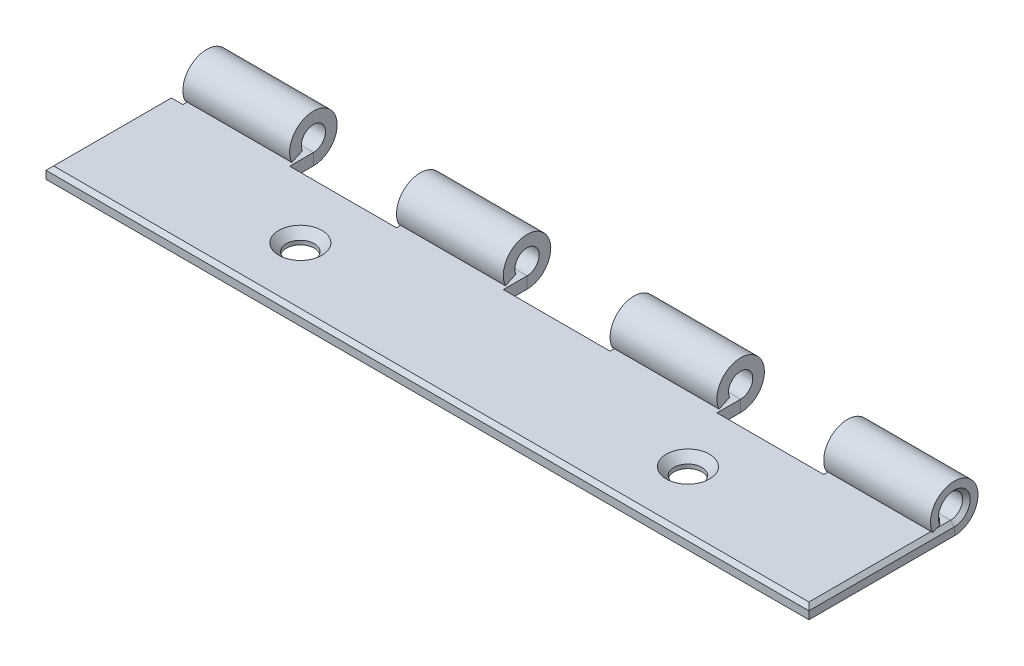
ISO-10303-21;
HEADER;
FILE_DESCRIPTION(('STEP AP214'),'2;1');
FILE_NAME('part.step','',(''),(''),'','','');
FILE_SCHEMA(('AUTOMOTIVE_DESIGN { 1 0 10303 214 1 1 1 1 }'));
ENDSEC;
DATA;
#1=APPLICATION_CONTEXT('core data for automotive mechanical design processes');
#2=APPLICATION_PROTOCOL_DEFINITION('international standard','automotive_design',2000,#1);
#3=PRODUCT_CONTEXT('',#1,'mechanical');
#4=PRODUCT('Part','Part','',(#3));
#5=PRODUCT_RELATED_PRODUCT_CATEGORY('part','',(#4));
#6=PRODUCT_DEFINITION_FORMATION('','',#4);
#7=PRODUCT_DEFINITION_CONTEXT('part definition',#1,'design');
#8=PRODUCT_DEFINITION('design','',#6,#7);
#9=PRODUCT_DEFINITION_SHAPE('','',#8);
#10=(LENGTH_UNIT() NAMED_UNIT(*) SI_UNIT(.MILLI.,.METRE.));
#11=(NAMED_UNIT(*) PLANE_ANGLE_UNIT() SI_UNIT($,.RADIAN.));
#12=(NAMED_UNIT(*) SI_UNIT($,.STERADIAN.) SOLID_ANGLE_UNIT());
#13=UNCERTAINTY_MEASURE_WITH_UNIT(LENGTH_MEASURE(1.E-05),#10,'distance_accuracy_value','');
#14=(GEOMETRIC_REPRESENTATION_CONTEXT(3) GLOBAL_UNCERTAINTY_ASSIGNED_CONTEXT((#13)) GLOBAL_UNIT_ASSIGNED_CONTEXT((#10,
#11,#12)) REPRESENTATION_CONTEXT('',''));
#15=CARTESIAN_POINT('',(0.,0.,0.));
#16=DIRECTION('',(0.,0.,1.));
#17=DIRECTION('',(1.,0.,0.));
#18=AXIS2_PLACEMENT_3D('',#15,#16,#17);
#19=CARTESIAN_POINT('',(-48.,-1.524,-4.85775));
#20=DIRECTION('',(1.,0.,0.));
#21=DIRECTION('',(0.,0.,-1.));
#22=AXIS2_PLACEMENT_3D('',#19,#20,#21);
#23=PLANE('',#22);
#24=DIRECTION('',(0.,0.,1.));
#25=VECTOR('',#24,1.);
#26=CARTESIAN_POINT('',(-48.,0.,0.));
#27=LINE('',#26,#25);
#28=CARTESIAN_POINT('',(-48.,0.,-7.96925));
#29=VERTEX_POINT('',#28);
#30=CARTESIAN_POINT('',(-48.,0.,-4.85775));
#31=VERTEX_POINT('',#30);
#32=EDGE_CURVE('E267',#29,#31,#27,.T.);
#33=ORIENTED_EDGE('',*,*,#32,.F.);
#34=DIRECTION('',(0.,-1.,0.));
#35=VECTOR('',#34,1.);
#36=CARTESIAN_POINT('',(-48.,0.,-7.96925));
#37=LINE('',#36,#35);
#38=CARTESIAN_POINT('',(-48.,-1.524,-7.96925));
#39=VERTEX_POINT('',#38);
#40=EDGE_CURVE('E252',#29,#39,#37,.T.);
#41=ORIENTED_EDGE('',*,*,#40,.T.);
#42=DIRECTION('',(0.,0.,-1.));
#43=VECTOR('',#42,1.);
#44=CARTESIAN_POINT('',(-48.,-1.524,-4.85775));
#45=LINE('',#44,#43);
#46=CARTESIAN_POINT('',(-48.,-1.524,-4.85775));
#47=VERTEX_POINT('',#46);
#48=EDGE_CURVE('E251',#47,#39,#45,.T.);
#49=ORIENTED_EDGE('',*,*,#48,.F.);
#50=DIRECTION('',(0.,1.,0.));
#51=VECTOR('',#50,1.);
#52=CARTESIAN_POINT('',(-48.,-1.524,-4.85775));
#53=LINE('',#52,#51);
#54=EDGE_CURVE('E236',#47,#31,#53,.T.);
#55=ORIENTED_EDGE('',*,*,#54,.T.);
#56=EDGE_LOOP('',(#33,#41,#49,#55));
#57=FACE_BOUND('',#56,.T.);
#58=ADVANCED_FACE('F47',(#57),#23,.F.);
#59=CARTESIAN_POINT('',(-34.,-1.524,-4.85775));
#60=DIRECTION('',(-1.,0.,0.));
#61=DIRECTION('',(0.,0.,1.));
#62=AXIS2_PLACEMENT_3D('',#59,#60,#61);
#63=PLANE('',#62);
#64=DIRECTION('',(0.,0.,1.));
#65=VECTOR('',#64,1.);
#66=CARTESIAN_POINT('',(-34.,-1.524,-4.85775));
#67=LINE('',#66,#65);
#68=CARTESIAN_POINT('',(-34.,-1.524,-7.96925));
#69=VERTEX_POINT('',#68);
#70=CARTESIAN_POINT('',(-34.,-1.524,-4.85775));
#71=VERTEX_POINT('',#70);
#72=EDGE_CURVE('E277',#69,#71,#67,.T.);
#73=ORIENTED_EDGE('',*,*,#72,.F.);
#74=DIRECTION('',(0.,1.,0.));
#75=VECTOR('',#74,1.);
#76=CARTESIAN_POINT('',(-34.,-1.524,-7.96925));
#77=LINE('',#76,#75);
#78=CARTESIAN_POINT('',(-34.,0.,-7.96925));
#79=VERTEX_POINT('',#78);
#80=EDGE_CURVE('E441',#69,#79,#77,.T.);
#81=ORIENTED_EDGE('',*,*,#80,.T.);
#82=DIRECTION('',(0.,0.,-1.));
#83=VECTOR('',#82,1.);
#84=CARTESIAN_POINT('',(-34.,0.,0.));
#85=LINE('',#84,#83);
#86=CARTESIAN_POINT('',(-34.,0.,-4.85775));
#87=VERTEX_POINT('',#86);
#88=EDGE_CURVE('E291',#87,#79,#85,.T.);
#89=ORIENTED_EDGE('',*,*,#88,.F.);
#90=DIRECTION('',(0.,1.,0.));
#91=VECTOR('',#90,1.);
#92=CARTESIAN_POINT('',(-34.,-1.524,-4.85775));
#93=LINE('',#92,#91);
#94=EDGE_CURVE('E283',#71,#87,#93,.T.);
#95=ORIENTED_EDGE('',*,*,#94,.F.);
#96=EDGE_LOOP('',(#73,#81,#89,#95));
#97=FACE_BOUND('',#96,.T.);
#98=ADVANCED_FACE('F515',(#97),#63,.F.);
#99=CARTESIAN_POINT('',(-20.,-1.524,-4.85775));
#100=DIRECTION('',(1.,0.,0.));
#101=DIRECTION('',(0.,0.,-1.));
#102=AXIS2_PLACEMENT_3D('',#99,#100,#101);
#103=PLANE('',#102);
#104=DIRECTION('',(0.,0.,1.));
#105=VECTOR('',#104,1.);
#106=CARTESIAN_POINT('',(-20.,0.,0.));
#107=LINE('',#106,#105);
#108=CARTESIAN_POINT('',(-20.,0.,-7.96925));
#109=VERTEX_POINT('',#108);
#110=CARTESIAN_POINT('',(-20.,0.,-4.85775));
#111=VERTEX_POINT('',#110);
#112=EDGE_CURVE('E298',#109,#111,#107,.T.);
#113=ORIENTED_EDGE('',*,*,#112,.F.);
#114=DIRECTION('',(0.,-1.,0.));
#115=VECTOR('',#114,1.);
#116=CARTESIAN_POINT('',(-20.,0.,-7.96925));
#117=LINE('',#116,#115);
#118=CARTESIAN_POINT('',(-20.,-1.524,-7.96925));
#119=VERTEX_POINT('',#118);
#120=EDGE_CURVE('E439',#109,#119,#117,.T.);
#121=ORIENTED_EDGE('',*,*,#120,.T.);
#122=DIRECTION('',(0.,0.,-1.));
#123=VECTOR('',#122,1.);
#124=CARTESIAN_POINT('',(-20.,-1.524,-4.85775));
#125=LINE('',#124,#123);
#126=CARTESIAN_POINT('',(-20.,-1.524,-4.85775));
#127=VERTEX_POINT('',#126);
#128=EDGE_CURVE('E274',#127,#119,#125,.T.);
#129=ORIENTED_EDGE('',*,*,#128,.F.);
#130=DIRECTION('',(0.,1.,0.));
#131=VECTOR('',#130,1.);
#132=CARTESIAN_POINT('',(-20.,-1.524,-4.85775));
#133=LINE('',#132,#131);
#134=EDGE_CURVE('E284',#127,#111,#133,.T.);
#135=ORIENTED_EDGE('',*,*,#134,.T.);
#136=EDGE_LOOP('',(#113,#121,#129,#135));
#137=FACE_BOUND('',#136,.T.);
#138=ADVANCED_FACE('F521',(#137),#103,.F.);
#139=CARTESIAN_POINT('',(-5.99999999999999,-1.524,-4.85775));
#140=DIRECTION('',(-1.,0.,0.));
#141=DIRECTION('',(0.,0.,1.));
#142=AXIS2_PLACEMENT_3D('',#139,#140,#141);
#143=PLANE('',#142);
#144=DIRECTION('',(0.,0.,1.));
#145=VECTOR('',#144,1.);
#146=CARTESIAN_POINT('',(-5.99999999999999,-1.524,-4.85775));
#147=LINE('',#146,#145);
#148=CARTESIAN_POINT('',(-5.99999999999999,-1.524,-7.96925));
#149=VERTEX_POINT('',#148);
#150=CARTESIAN_POINT('',(-5.99999999999999,-1.524,-4.85775));
#151=VERTEX_POINT('',#150);
#152=EDGE_CURVE('E310',#149,#151,#147,.T.);
#153=ORIENTED_EDGE('',*,*,#152,.F.);
#154=DIRECTION('',(0.,1.,0.));
#155=VECTOR('',#154,1.);
#156=CARTESIAN_POINT('',(-5.99999999999999,-1.524,-7.96925));
#157=LINE('',#156,#155);
#158=CARTESIAN_POINT('',(-5.99999999999999,0.,-7.96925));
#159=VERTEX_POINT('',#158);
#160=EDGE_CURVE('E437',#149,#159,#157,.T.);
#161=ORIENTED_EDGE('',*,*,#160,.T.);
#162=DIRECTION('',(0.,0.,-1.));
#163=VECTOR('',#162,1.);
#164=CARTESIAN_POINT('',(-5.99999999999999,0.,0.));
#165=LINE('',#164,#163);
#166=CARTESIAN_POINT('',(-5.99999999999999,0.,-4.85775));
#167=VERTEX_POINT('',#166);
#168=EDGE_CURVE('E324',#167,#159,#165,.T.);
#169=ORIENTED_EDGE('',*,*,#168,.F.);
#170=DIRECTION('',(0.,1.,0.));
#171=VECTOR('',#170,1.);
#172=CARTESIAN_POINT('',(-5.99999999999999,-1.524,-4.85775));
#173=LINE('',#172,#171);
#174=EDGE_CURVE('E316',#151,#167,#173,.T.);
#175=ORIENTED_EDGE('',*,*,#174,.F.);
#176=EDGE_LOOP('',(#153,#161,#169,#175));
#177=FACE_BOUND('',#176,.T.);
#178=ADVANCED_FACE('F620',(#177),#143,.F.);
#179=CARTESIAN_POINT('',(8.,-1.524,-4.85775));
#180=DIRECTION('',(1.,0.,0.));
#181=DIRECTION('',(0.,0.,-1.));
#182=AXIS2_PLACEMENT_3D('',#179,#180,#181);
#183=PLANE('',#182);
#184=DIRECTION('',(0.,0.,1.));
#185=VECTOR('',#184,1.);
#186=CARTESIAN_POINT('',(8.,0.,0.));
#187=LINE('',#186,#185);
#188=CARTESIAN_POINT('',(8.00000000000001,0.,-7.96925));
#189=VERTEX_POINT('',#188);
#190=CARTESIAN_POINT('',(8.,0.,-4.85775));
#191=VERTEX_POINT('',#190);
#192=EDGE_CURVE('E331',#189,#191,#187,.T.);
#193=ORIENTED_EDGE('',*,*,#192,.F.);
#194=DIRECTION('',(0.,-1.,0.));
#195=VECTOR('',#194,1.);
#196=CARTESIAN_POINT('',(8.00000000000001,0.,-7.96925));
#197=LINE('',#196,#195);
#198=CARTESIAN_POINT('',(8.,-1.524,-7.96925));
#199=VERTEX_POINT('',#198);
#200=EDGE_CURVE('E435',#189,#199,#197,.T.);
#201=ORIENTED_EDGE('',*,*,#200,.T.);
#202=DIRECTION('',(0.,0.,-1.));
#203=VECTOR('',#202,1.);
#204=CARTESIAN_POINT('',(8.,-1.524,-4.85775));
#205=LINE('',#204,#203);
#206=CARTESIAN_POINT('',(8.,-1.524,-4.85775));
#207=VERTEX_POINT('',#206);
#208=EDGE_CURVE('E307',#207,#199,#205,.T.);
#209=ORIENTED_EDGE('',*,*,#208,.F.);
#210=DIRECTION('',(0.,1.,0.));
#211=VECTOR('',#210,1.);
#212=CARTESIAN_POINT('',(8.,-1.524,-4.85775));
#213=LINE('',#212,#211);
#214=EDGE_CURVE('E317',#207,#191,#213,.T.);
#215=ORIENTED_EDGE('',*,*,#214,.T.);
#216=EDGE_LOOP('',(#193,#201,#209,#215));
#217=FACE_BOUND('',#216,.T.);
#218=ADVANCED_FACE('F644',(#217),#183,.F.);
#219=CARTESIAN_POINT('',(0.,0.916593509486624,-6.53048638807933));
#220=DIRECTION('',(0.,0.906307787036645,0.42261826174071));
#221=DIRECTION('',(-1.,0.,0.));
#222=AXIS2_PLACEMENT_3D('',#219,#220,#221);
#223=PLANE('',#222);
#224=DIRECTION('',(0.,0.42261826174071,-0.906307787036645));
#225=VECTOR('',#224,1.);
#226=CARTESIAN_POINT('',(-20.,0.916593509486624,-6.53048638807933));
#227=LINE('',#226,#225);
#228=CARTESIAN_POINT('',(-20.,0.916593509486624,-6.53048638807933));
#229=VERTEX_POINT('',#228);
#230=CARTESIAN_POINT('',(-20.,0.272523278593782,-5.14927332063548));
#231=VERTEX_POINT('',#230);
#232=EDGE_CURVE('E296',#229,#231,#227,.F.);
#233=ORIENTED_EDGE('',*,*,#232,.F.);
#234=DIRECTION('',(-1.,0.,0.));
#235=VECTOR('',#234,1.);
#236=CARTESIAN_POINT('',(-50.,0.916593509486624,-6.53048638807933));
#237=LINE('',#236,#235);
#238=CARTESIAN_POINT('',(-5.99999999999999,0.916593509486624,-6.53048638807933));
#239=VERTEX_POINT('',#238);
#240=EDGE_CURVE('E557',#239,#229,#237,.T.);
#241=ORIENTED_EDGE('',*,*,#240,.F.);
#242=DIRECTION('',(0.,-0.42261826174071,0.906307787036645));
#243=VECTOR('',#242,1.);
#244=CARTESIAN_POINT('',(-5.99999999999999,0.916593509486624,-6.53048638807933));
#245=LINE('',#244,#243);
#246=CARTESIAN_POINT('',(-5.99999999999999,0.272523278593782,-5.14927332063548));
#247=VERTEX_POINT('',#246);
#248=EDGE_CURVE('E320',#247,#239,#245,.F.);
#249=ORIENTED_EDGE('',*,*,#248,.F.);
#250=DIRECTION('',(-1.,0.,0.));
#251=VECTOR('',#250,1.);
#252=CARTESIAN_POINT('',(-50.,0.272523278593782,-5.14927332063548));
#253=LINE('',#252,#251);
#254=EDGE_CURVE('E632',#247,#231,#253,.T.);
#255=ORIENTED_EDGE('',*,*,#254,.T.);
#256=EDGE_LOOP('',(#233,#241,#249,#255));
#257=FACE_BOUND('',#256,.T.);
#258=ADVANCED_FACE('F635',(#257),#223,.F.);
#259=CARTESIAN_POINT('',(-50.,1.5875,-7.96925));
#260=DIRECTION('',(-1.,0.,0.));
#261=DIRECTION('',(0.,-0.42261826174071,0.906307787036645));
#262=AXIS2_PLACEMENT_3D('',#259,#260,#261);
#263=CYLINDRICAL_SURFACE('',#262,3.1115);
#264=DIRECTION('',(-1.,0.,0.));
#265=VECTOR('',#264,1.);
#266=CARTESIAN_POINT('',(-50.,-1.524,-7.96925000000001));
#267=LINE('',#266,#265);
#268=EDGE_CURVE('E377',#119,#149,#267,.F.);
#269=ORIENTED_EDGE('',*,*,#268,.F.);
#270=CARTESIAN_POINT('',(-20.,1.5875,-7.96925));
#271=DIRECTION('',(1.,0.,0.));
#272=DIRECTION('',(0.,0.,-1.));
#273=AXIS2_PLACEMENT_3D('',#270,#271,#272);
#274=CIRCLE('',#273,3.1115);
#275=EDGE_CURVE('E301',#231,#119,#274,.F.);
#276=ORIENTED_EDGE('',*,*,#275,.F.);
#277=ORIENTED_EDGE('',*,*,#254,.F.);
#278=CARTESIAN_POINT('',(-5.99999999999999,1.5875,-7.96925));
#279=DIRECTION('',(-1.,0.,0.));
#280=DIRECTION('',(0.,0.,1.));
#281=AXIS2_PLACEMENT_3D('',#278,#279,#280);
#282=CIRCLE('',#281,3.1115);
#283=EDGE_CURVE('E327',#149,#247,#282,.F.);
#284=ORIENTED_EDGE('',*,*,#283,.F.);
#285=EDGE_LOOP('',(#269,#276,#277,#284));
#286=FACE_BOUND('',#285,.T.);
#287=ADVANCED_FACE('F629',(#286),#263,.T.);
#288=CARTESIAN_POINT('',(-50.,1.5875,-7.96925));
#289=DIRECTION('',(-1.,0.,0.));
#290=DIRECTION('',(0.,-0.42261826174071,0.906307787036645));
#291=AXIS2_PLACEMENT_3D('',#288,#289,#290);
#292=CYLINDRICAL_SURFACE('',#291,1.5875);
#293=ORIENTED_EDGE('',*,*,#240,.T.);
#294=CARTESIAN_POINT('',(-20.,1.5875,-7.96925));
#295=DIRECTION('',(1.,0.,0.));
#296=DIRECTION('',(0.,0.,-1.));
#297=AXIS2_PLACEMENT_3D('',#294,#295,#296);
#298=CIRCLE('',#297,1.5875);
#299=EDGE_CURVE('E429',#229,#109,#298,.F.);
#300=ORIENTED_EDGE('',*,*,#299,.T.);
#301=DIRECTION('',(-1.,0.,0.));
#302=VECTOR('',#301,1.);
#303=CARTESIAN_POINT('',(-50.,0.,-7.96925));
#304=LINE('',#303,#302);
#305=EDGE_CURVE('E390',#109,#159,#304,.F.);
#306=ORIENTED_EDGE('',*,*,#305,.T.);
#307=CARTESIAN_POINT('',(-5.99999999999999,1.5875,-7.96925));
#308=DIRECTION('',(-1.,0.,0.));
#309=DIRECTION('',(0.,0.,1.));
#310=AXIS2_PLACEMENT_3D('',#307,#308,#309);
#311=CIRCLE('',#310,1.5875);
#312=EDGE_CURVE('E420',#159,#239,#311,.F.);
#313=ORIENTED_EDGE('',*,*,#312,.T.);
#314=EDGE_LOOP('',(#293,#300,#306,#313));
#315=FACE_BOUND('',#314,.T.);
#316=ADVANCED_FACE('F614',(#315),#292,.F.);
#317=DIRECTION('',(0.,0.42261826174071,-0.906307787036645));
#318=VECTOR('',#317,1.);
#319=CARTESIAN_POINT('',(8.,0.916593509486624,-6.53048638807933));
#320=LINE('',#319,#318);
#321=CARTESIAN_POINT('',(8.00000000000001,0.916593509486624,-6.53048638807933));
#322=VERTEX_POINT('',#321);
#323=CARTESIAN_POINT('',(8.,0.272523278593782,-5.14927332063548));
#324=VERTEX_POINT('',#323);
#325=EDGE_CURVE('E329',#322,#324,#320,.F.);
#326=ORIENTED_EDGE('',*,*,#325,.F.);
#327=CARTESIAN_POINT('',(22.,0.916593509486624,-6.53048638807933));
#328=VERTEX_POINT('',#327);
#329=EDGE_CURVE('E394',#328,#322,#237,.T.);
#330=ORIENTED_EDGE('',*,*,#329,.F.);
#331=DIRECTION('',(0.,-0.42261826174071,0.906307787036645));
#332=VECTOR('',#331,1.);
#333=CARTESIAN_POINT('',(22.,0.916593509486624,-6.53048638807933));
#334=LINE('',#333,#332);
#335=CARTESIAN_POINT('',(22.,0.272523278593782,-5.14927332063548));
#336=VERTEX_POINT('',#335);
#337=EDGE_CURVE('E353',#336,#328,#334,.F.);
#338=ORIENTED_EDGE('',*,*,#337,.F.);
#339=EDGE_CURVE('E385',#336,#324,#253,.T.);
#340=ORIENTED_EDGE('',*,*,#339,.T.);
#341=EDGE_LOOP('',(#326,#330,#338,#340));
#342=FACE_BOUND('',#341,.T.);
#343=ADVANCED_FACE('F570',(#342),#223,.F.);
#344=CARTESIAN_POINT('',(22.,-1.524,-7.96925));
#345=VERTEX_POINT('',#344);
#346=EDGE_CURVE('E580',#199,#345,#267,.F.);
#347=ORIENTED_EDGE('',*,*,#346,.F.);
#348=CARTESIAN_POINT('',(8.00000000000001,1.5875,-7.96925));
#349=DIRECTION('',(1.,0.,0.));
#350=DIRECTION('',(0.,0.,-1.));
#351=AXIS2_PLACEMENT_3D('',#348,#349,#350);
#352=CIRCLE('',#351,3.1115);
#353=EDGE_CURVE('E334',#324,#199,#352,.F.);
#354=ORIENTED_EDGE('',*,*,#353,.F.);
#355=ORIENTED_EDGE('',*,*,#339,.F.);
#356=CARTESIAN_POINT('',(22.,1.5875,-7.96925));
#357=DIRECTION('',(-1.,0.,0.));
#358=DIRECTION('',(0.,0.,1.));
#359=AXIS2_PLACEMENT_3D('',#356,#357,#358);
#360=CIRCLE('',#359,3.1115);
#361=EDGE_CURVE('E360',#345,#336,#360,.F.);
#362=ORIENTED_EDGE('',*,*,#361,.F.);
#363=EDGE_LOOP('',(#347,#354,#355,#362));
#364=FACE_BOUND('',#363,.T.);
#365=ADVANCED_FACE('F578',(#364),#263,.T.);
#366=ORIENTED_EDGE('',*,*,#329,.T.);
#367=CARTESIAN_POINT('',(8.00000000000001,1.5875,-7.96925));
#368=DIRECTION('',(1.,0.,0.));
#369=DIRECTION('',(0.,0.,-1.));
#370=AXIS2_PLACEMENT_3D('',#367,#368,#369);
#371=CIRCLE('',#370,1.5875);
#372=EDGE_CURVE('E423',#322,#189,#371,.F.);
#373=ORIENTED_EDGE('',*,*,#372,.T.);
#374=CARTESIAN_POINT('',(22.,0.,-7.96925));
#375=VERTEX_POINT('',#374);
#376=EDGE_CURVE('E610',#189,#375,#304,.F.);
#377=ORIENTED_EDGE('',*,*,#376,.T.);
#378=CARTESIAN_POINT('',(22.,1.5875,-7.96925));
#379=DIRECTION('',(-1.,0.,0.));
#380=DIRECTION('',(0.,0.,1.));
#381=AXIS2_PLACEMENT_3D('',#378,#379,#380);
#382=CIRCLE('',#381,1.5875);
#383=EDGE_CURVE('E408',#375,#328,#382,.F.);
#384=ORIENTED_EDGE('',*,*,#383,.T.);
#385=EDGE_LOOP('',(#366,#373,#377,#384));
#386=FACE_BOUND('',#385,.T.);
#387=ADVANCED_FACE('F564',(#386),#292,.F.);
#388=CARTESIAN_POINT('',(22.,-1.524,-4.85775));
#389=DIRECTION('',(-1.,0.,0.));
#390=DIRECTION('',(0.,0.,1.));
#391=AXIS2_PLACEMENT_3D('',#388,#389,#390);
#392=PLANE('',#391);
#393=DIRECTION('',(0.,0.,1.));
#394=VECTOR('',#393,1.);
#395=CARTESIAN_POINT('',(22.,-1.524,-4.85775));
#396=LINE('',#395,#394);
#397=CARTESIAN_POINT('',(22.,-1.524,-4.85775));
#398=VERTEX_POINT('',#397);
#399=EDGE_CURVE('E343',#345,#398,#396,.T.);
#400=ORIENTED_EDGE('',*,*,#399,.F.);
#401=DIRECTION('',(0.,1.,0.));
#402=VECTOR('',#401,1.);
#403=CARTESIAN_POINT('',(22.,-1.524,-7.96925));
#404=LINE('',#403,#402);
#405=EDGE_CURVE('E417',#345,#375,#404,.T.);
#406=ORIENTED_EDGE('',*,*,#405,.T.);
#407=DIRECTION('',(0.,0.,-1.));
#408=VECTOR('',#407,1.);
#409=CARTESIAN_POINT('',(22.,0.,0.));
#410=LINE('',#409,#408);
#411=CARTESIAN_POINT('',(22.,0.,-4.85775));
#412=VERTEX_POINT('',#411);
#413=EDGE_CURVE('E357',#412,#375,#410,.T.);
#414=ORIENTED_EDGE('',*,*,#413,.F.);
#415=DIRECTION('',(0.,1.,0.));
#416=VECTOR('',#415,1.);
#417=CARTESIAN_POINT('',(22.,-1.524,-4.85775));
#418=LINE('',#417,#416);
#419=EDGE_CURVE('E349',#398,#412,#418,.T.);
#420=ORIENTED_EDGE('',*,*,#419,.F.);
#421=EDGE_LOOP('',(#400,#406,#414,#420));
#422=FACE_BOUND('',#421,.T.);
#423=ADVANCED_FACE('F668',(#422),#392,.F.);
#424=CARTESIAN_POINT('',(36.,-1.524,-4.85775));
#425=DIRECTION('',(1.,0.,0.));
#426=DIRECTION('',(0.,0.,-1.));
#427=AXIS2_PLACEMENT_3D('',#424,#425,#426);
#428=PLANE('',#427);
#429=DIRECTION('',(0.,0.,1.));
#430=VECTOR('',#429,1.);
#431=CARTESIAN_POINT('',(36.,0.,0.));
#432=LINE('',#431,#430);
#433=CARTESIAN_POINT('',(36.,0.,-7.96925));
#434=VERTEX_POINT('',#433);
#435=CARTESIAN_POINT('',(36.,0.,-4.85775));
#436=VERTEX_POINT('',#435);
#437=EDGE_CURVE('E364',#434,#436,#432,.T.);
#438=ORIENTED_EDGE('',*,*,#437,.F.);
#439=DIRECTION('',(0.,-1.,0.));
#440=VECTOR('',#439,1.);
#441=CARTESIAN_POINT('',(36.,0.,-7.96925));
#442=LINE('',#441,#440);
#443=CARTESIAN_POINT('',(36.,-1.524,-7.96925));
#444=VERTEX_POINT('',#443);
#445=EDGE_CURVE('E415',#434,#444,#442,.T.);
#446=ORIENTED_EDGE('',*,*,#445,.T.);
#447=DIRECTION('',(0.,0.,-1.));
#448=VECTOR('',#447,1.);
#449=CARTESIAN_POINT('',(36.,-1.524,-4.85775));
#450=LINE('',#449,#448);
#451=CARTESIAN_POINT('',(36.,-1.524,-4.85775));
#452=VERTEX_POINT('',#451);
#453=EDGE_CURVE('E340',#452,#444,#450,.T.);
#454=ORIENTED_EDGE('',*,*,#453,.F.);
#455=DIRECTION('',(0.,1.,0.));
#456=VECTOR('',#455,1.);
#457=CARTESIAN_POINT('',(36.,-1.524,-4.85775));
#458=LINE('',#457,#456);
#459=EDGE_CURVE('E350',#452,#436,#458,.T.);
#460=ORIENTED_EDGE('',*,*,#459,.T.);
#461=EDGE_LOOP('',(#438,#446,#454,#460));
#462=FACE_BOUND('',#461,.T.);
#463=ADVANCED_FACE('F672',(#462),#428,.F.);
#464=CARTESIAN_POINT('',(49.5,0.916593509486624,-6.53048638807933));
#465=VERTEX_POINT('',#464);
#466=CARTESIAN_POINT('',(36.,0.916593509486624,-6.53048638807933));
#467=VERTEX_POINT('',#466);
#468=EDGE_CURVE('E392',#465,#467,#237,.T.);
#469=ORIENTED_EDGE('',*,*,#468,.F.);
#470=DIRECTION('',(0.707106781186548,-0.298836238730127,0.640856382055785));
#471=VECTOR('',#470,1.);
#472=CARTESIAN_POINT('',(47.9125,1.5875,-7.96925));
#473=LINE('',#472,#471);
#474=CARTESIAN_POINT('',(50.,0.705284378616269,-6.077332494561));
#475=VERTEX_POINT('',#474);
#476=EDGE_CURVE('E447',#465,#475,#473,.T.);
#477=ORIENTED_EDGE('',*,*,#476,.T.);
#478=DIRECTION('',(0.,-0.42261826174071,0.906307787036645));
#479=VECTOR('',#478,1.);
#480=CARTESIAN_POINT('',(50.,0.916593509486624,-6.53048638807933));
#481=LINE('',#480,#479);
#482=CARTESIAN_POINT('',(50.,0.272523278593782,-5.14927332063548));
#483=VERTEX_POINT('',#482);
#484=EDGE_CURVE('E396',#475,#483,#481,.T.);
#485=ORIENTED_EDGE('',*,*,#484,.T.);
#486=CARTESIAN_POINT('',(36.,0.272523278593782,-5.14927332063548));
#487=VERTEX_POINT('',#486);
#488=EDGE_CURVE('E382',#483,#487,#253,.T.);
#489=ORIENTED_EDGE('',*,*,#488,.T.);
#490=DIRECTION('',(0.,0.42261826174071,-0.906307787036645));
#491=VECTOR('',#490,1.);
#492=CARTESIAN_POINT('',(36.,0.916593509486624,-6.53048638807933));
#493=LINE('',#492,#491);
#494=EDGE_CURVE('E362',#467,#487,#493,.F.);
#495=ORIENTED_EDGE('',*,*,#494,.F.);
#496=EDGE_LOOP('',(#469,#477,#485,#489,#495));
#497=FACE_BOUND('',#496,.T.);
#498=ADVANCED_FACE('F680',(#497),#223,.F.);
#499=CARTESIAN_POINT('',(50.,-1.524,-7.96925000000001));
#500=VERTEX_POINT('',#499);
#501=EDGE_CURVE('E378',#444,#500,#267,.F.);
#502=ORIENTED_EDGE('',*,*,#501,.F.);
#503=CARTESIAN_POINT('',(36.,1.5875,-7.96925));
#504=DIRECTION('',(1.,0.,0.));
#505=DIRECTION('',(0.,0.,-1.));
#506=AXIS2_PLACEMENT_3D('',#503,#504,#505);
#507=CIRCLE('',#506,3.1115);
#508=EDGE_CURVE('E367',#487,#444,#507,.F.);
#509=ORIENTED_EDGE('',*,*,#508,.F.);
#510=ORIENTED_EDGE('',*,*,#488,.F.);
#511=CARTESIAN_POINT('',(50.,1.5875,-7.96925));
#512=DIRECTION('',(-1.,0.,0.));
#513=DIRECTION('',(0.,0.,1.));
#514=AXIS2_PLACEMENT_3D('',#511,#512,#513);
#515=CIRCLE('',#514,3.1115);
#516=EDGE_CURVE('E376',#500,#483,#515,.F.);
#517=ORIENTED_EDGE('',*,*,#516,.F.);
#518=EDGE_LOOP('',(#502,#509,#510,#517));
#519=FACE_BOUND('',#518,.T.);
#520=ADVANCED_FACE('F591',(#519),#263,.T.);
#521=CARTESIAN_POINT('',(49.5,0.,-7.96925));
#522=VERTEX_POINT('',#521);
#523=EDGE_CURVE('E391',#434,#522,#304,.F.);
#524=ORIENTED_EDGE('',*,*,#523,.T.);
#525=CARTESIAN_POINT('',(49.5,1.5875,-7.96925));
#526=DIRECTION('',(1.,0.,0.));
#527=DIRECTION('',(0.,0.,-1.));
#528=AXIS2_PLACEMENT_3D('',#525,#526,#527);
#529=CIRCLE('',#528,1.5875);
#530=EDGE_CURVE('E444',#522,#465,#529,.T.);
#531=ORIENTED_EDGE('',*,*,#530,.T.);
#532=ORIENTED_EDGE('',*,*,#468,.T.);
#533=CARTESIAN_POINT('',(36.,1.5875,-7.96925));
#534=DIRECTION('',(1.,0.,0.));
#535=DIRECTION('',(0.,0.,-1.));
#536=AXIS2_PLACEMENT_3D('',#533,#534,#535);
#537=CIRCLE('',#536,1.5875);
#538=EDGE_CURVE('E412',#467,#434,#537,.F.);
#539=ORIENTED_EDGE('',*,*,#538,.T.);
#540=EDGE_LOOP('',(#524,#531,#532,#539));
#541=FACE_BOUND('',#540,.T.);
#542=ADVANCED_FACE('F607',(#541),#292,.F.);
#543=CARTESIAN_POINT('',(-50.,-1.524,11.08075));
#544=DIRECTION('',(-1.,0.,0.));
#545=DIRECTION('',(0.,0.,1.));
#546=AXIS2_PLACEMENT_3D('',#543,#544,#545);
#547=PLANE('',#546);
#548=DIRECTION('',(0.,1.,0.));
#549=VECTOR('',#548,1.);
#550=CARTESIAN_POINT('',(-50.,-1.524,11.08075));
#551=LINE('',#550,#549);
#552=CARTESIAN_POINT('',(-50.,-1.524,11.08075));
#553=VERTEX_POINT('',#552);
#554=CARTESIAN_POINT('',(-50.,-0.5,11.08075));
#555=VERTEX_POINT('',#554);
#556=EDGE_CURVE('E405',#553,#555,#551,.T.);
#557=ORIENTED_EDGE('',*,*,#556,.T.);
#558=DIRECTION('',(0.,0.,-1.));
#559=VECTOR('',#558,1.);
#560=CARTESIAN_POINT('',(-50.,-0.5,-4.85775));
#561=LINE('',#560,#559);
#562=CARTESIAN_POINT('',(-50.,-0.500000000000001,-4.85775));
#563=VERTEX_POINT('',#562);
#564=EDGE_CURVE('E457',#555,#563,#561,.T.);
#565=ORIENTED_EDGE('',*,*,#564,.T.);
#566=DIRECTION('',(0.,1.,0.));
#567=VECTOR('',#566,1.);
#568=CARTESIAN_POINT('',(-50.,-1.524,-4.85775));
#569=LINE('',#568,#567);
#570=CARTESIAN_POINT('',(-50.,-1.524,-4.85775));
#571=VERTEX_POINT('',#570);
#572=EDGE_CURVE('E272',#571,#563,#569,.T.);
#573=ORIENTED_EDGE('',*,*,#572,.F.);
#574=DIRECTION('',(0.,0.,1.));
#575=VECTOR('',#574,1.);
#576=CARTESIAN_POINT('',(-50.,-1.524,11.08075));
#577=LINE('',#576,#575);
#578=EDGE_CURVE('E262',#571,#553,#577,.T.);
#579=ORIENTED_EDGE('',*,*,#578,.T.);
#580=EDGE_LOOP('',(#557,#565,#573,#579));
#581=FACE_BOUND('',#580,.T.);
#582=ADVANCED_FACE('F705',(#581),#547,.T.);
#583=CARTESIAN_POINT('',(50.,-1.524,11.08075));
#584=DIRECTION('',(1.,0.,0.));
#585=DIRECTION('',(0.,0.,-1.));
#586=AXIS2_PLACEMENT_3D('',#583,#584,#585);
#587=PLANE('',#586);
#588=DIRECTION('',(0.,-1.,0.));
#589=VECTOR('',#588,1.);
#590=CARTESIAN_POINT('',(50.,0.,-7.96925));
#591=LINE('',#590,#589);
#592=CARTESIAN_POINT('',(50.,-0.5,-7.96925));
#593=VERTEX_POINT('',#592);
#594=EDGE_CURVE('E381',#593,#500,#591,.T.);
#595=ORIENTED_EDGE('',*,*,#594,.F.);
#596=DIRECTION('',(0.,0.,1.));
#597=VECTOR('',#596,1.);
#598=CARTESIAN_POINT('',(50.,-0.5,11.08075));
#599=LINE('',#598,#597);
#600=CARTESIAN_POINT('',(50.,-0.5,11.08075));
#601=VERTEX_POINT('',#600);
#602=EDGE_CURVE('E62',#593,#601,#599,.T.);
#603=ORIENTED_EDGE('',*,*,#602,.T.);
#604=DIRECTION('',(0.,1.,0.));
#605=VECTOR('',#604,1.);
#606=CARTESIAN_POINT('',(50.,-1.524,11.08075));
#607=LINE('',#606,#605);
#608=CARTESIAN_POINT('',(50.,-1.524,11.08075));
#609=VERTEX_POINT('',#608);
#610=EDGE_CURVE('E406',#609,#601,#607,.T.);
#611=ORIENTED_EDGE('',*,*,#610,.F.);
#612=DIRECTION('',(0.,0.,-1.));
#613=VECTOR('',#612,1.);
#614=CARTESIAN_POINT('',(50.,-1.524,11.08075));
#615=LINE('',#614,#613);
#616=EDGE_CURVE('E398',#609,#500,#615,.T.);
#617=ORIENTED_EDGE('',*,*,#616,.T.);
#618=EDGE_LOOP('',(#595,#603,#611,#617));
#619=FACE_BOUND('',#618,.T.);
#620=ADVANCED_FACE('F511',(#619),#587,.T.);
#621=CARTESIAN_POINT('',(-50.,-1.524,11.08075));
#622=DIRECTION('',(0.,0.,1.));
#623=DIRECTION('',(1.,0.,0.));
#624=AXIS2_PLACEMENT_3D('',#621,#622,#623);
#625=PLANE('',#624);
#626=ORIENTED_EDGE('',*,*,#610,.T.);
#627=DIRECTION('',(-1.,0.,0.));
#628=VECTOR('',#627,1.);
#629=CARTESIAN_POINT('',(-50.,-0.5,11.08075));
#630=LINE('',#629,#628);
#631=EDGE_CURVE('E69',#601,#555,#630,.T.);
#632=ORIENTED_EDGE('',*,*,#631,.T.);
#633=ORIENTED_EDGE('',*,*,#556,.F.);
#634=DIRECTION('',(1.,0.,0.));
#635=VECTOR('',#634,1.);
#636=CARTESIAN_POINT('',(-50.,-1.524,11.08075));
#637=LINE('',#636,#635);
#638=EDGE_CURVE('E402',#553,#609,#637,.T.);
#639=ORIENTED_EDGE('',*,*,#638,.T.);
#640=EDGE_LOOP('',(#626,#632,#633,#639));
#641=FACE_BOUND('',#640,.T.);
#642=ADVANCED_FACE('F503',(#641),#625,.T.);
#643=CARTESIAN_POINT('',(0.,-1.524,0.));
#644=DIRECTION('',(0.,-1.,0.));
#645=DIRECTION('',(0.,0.,-1.));
#646=AXIS2_PLACEMENT_3D('',#643,#644,#645);
#647=PLANE('',#646);
#648=CARTESIAN_POINT('',(26.2,-1.524,3.14325));
#649=DIRECTION('',(0.,-1.,0.));
#650=DIRECTION('',(0.,0.,-1.));
#651=AXIS2_PLACEMENT_3D('',#648,#649,#650);
#652=CIRCLE('',#651,1.82879999999998);
#653=CARTESIAN_POINT('',(26.2,-1.524,1.31445000000001));
#654=VERTEX_POINT('',#653);
#655=EDGE_CURVE('E495',#654,#654,#652,.T.);
#656=ORIENTED_EDGE('',*,*,#655,.F.);
#657=EDGE_LOOP('',(#656));
#658=FACE_BOUND('',#657,.T.);
#659=CARTESIAN_POINT('',(-24.6,-1.524,3.14325));
#660=DIRECTION('',(0.,-1.,0.));
#661=DIRECTION('',(0.,0.,-1.));
#662=AXIS2_PLACEMENT_3D('',#659,#660,#661);
#663=CIRCLE('',#662,1.82879999999998);
#664=CARTESIAN_POINT('',(-24.6,-1.524,1.31445000000001));
#665=VERTEX_POINT('',#664);
#666=EDGE_CURVE('E468',#665,#665,#663,.T.);
#667=ORIENTED_EDGE('',*,*,#666,.F.);
#668=EDGE_LOOP('',(#667));
#669=FACE_BOUND('',#668,.T.);
#670=ORIENTED_EDGE('',*,*,#48,.T.);
#671=EDGE_CURVE('E374',#39,#69,#267,.F.);
#672=ORIENTED_EDGE('',*,*,#671,.T.);
#673=ORIENTED_EDGE('',*,*,#72,.T.);
#674=DIRECTION('',(1.,0.,0.));
#675=VECTOR('',#674,1.);
#676=CARTESIAN_POINT('',(-20.,-1.524,-4.85775));
#677=LINE('',#676,#675);
#678=EDGE_CURVE('E280',#71,#127,#677,.T.);
#679=ORIENTED_EDGE('',*,*,#678,.T.);
#680=ORIENTED_EDGE('',*,*,#128,.T.);
#681=ORIENTED_EDGE('',*,*,#268,.T.);
#682=ORIENTED_EDGE('',*,*,#152,.T.);
#683=DIRECTION('',(1.,0.,0.));
#684=VECTOR('',#683,1.);
#685=CARTESIAN_POINT('',(8.,-1.524,-4.85775));
#686=LINE('',#685,#684);
#687=EDGE_CURVE('E313',#151,#207,#686,.T.);
#688=ORIENTED_EDGE('',*,*,#687,.T.);
#689=ORIENTED_EDGE('',*,*,#208,.T.);
#690=ORIENTED_EDGE('',*,*,#346,.T.);
#691=ORIENTED_EDGE('',*,*,#399,.T.);
#692=DIRECTION('',(1.,0.,0.));
#693=VECTOR('',#692,1.);
#694=CARTESIAN_POINT('',(36.,-1.524,-4.85775));
#695=LINE('',#694,#693);
#696=EDGE_CURVE('E346',#398,#452,#695,.T.);
#697=ORIENTED_EDGE('',*,*,#696,.T.);
#698=ORIENTED_EDGE('',*,*,#453,.T.);
#699=ORIENTED_EDGE('',*,*,#501,.T.);
#700=ORIENTED_EDGE('',*,*,#616,.F.);
#701=ORIENTED_EDGE('',*,*,#638,.F.);
#702=ORIENTED_EDGE('',*,*,#578,.F.);
#703=DIRECTION('',(1.,0.,0.));
#704=VECTOR('',#703,1.);
#705=CARTESIAN_POINT('',(-48.,-1.524,-4.85775));
#706=LINE('',#705,#704);
#707=EDGE_CURVE('E241',#571,#47,#706,.T.);
#708=ORIENTED_EDGE('',*,*,#707,.T.);
#709=EDGE_LOOP('',(#670,#672,#673,#679,#680,#681,#682,#688,#689,#690,#691,#697,#698,#699,#700,
#701,#702,#708));
#710=FACE_BOUND('',#709,.T.);
#711=ADVANCED_FACE('F260',(#658,#669,#710),#647,.T.);
#712=CARTESIAN_POINT('',(0.,0.,0.));
#713=DIRECTION('',(0.,-1.,0.));
#714=DIRECTION('',(0.,0.,-1.));
#715=AXIS2_PLACEMENT_3D('',#712,#713,#714);
#716=PLANE('',#715);
#717=CARTESIAN_POINT('',(26.2,0.,3.14325));
#718=DIRECTION('',(0.,-1.,0.));
#719=DIRECTION('',(0.,0.,-1.));
#720=AXIS2_PLACEMENT_3D('',#717,#718,#719);
#721=CIRCLE('',#720,2.82879999999998);
#722=CARTESIAN_POINT('',(26.2,0.,0.314450000000018));
#723=VERTEX_POINT('',#722);
#724=EDGE_CURVE('E55',#723,#723,#721,.T.);
#725=ORIENTED_EDGE('',*,*,#724,.T.);
#726=EDGE_LOOP('',(#725));
#727=FACE_BOUND('',#726,.T.);
#728=CARTESIAN_POINT('',(-24.6,0.,3.14325));
#729=DIRECTION('',(0.,-1.,0.));
#730=DIRECTION('',(0.,0.,-1.));
#731=AXIS2_PLACEMENT_3D('',#728,#729,#730);
#732=CIRCLE('',#731,2.82879999999998);
#733=CARTESIAN_POINT('',(-24.6,0.,0.314450000000018));
#734=VERTEX_POINT('',#733);
#735=EDGE_CURVE('E475',#734,#734,#732,.T.);
#736=ORIENTED_EDGE('',*,*,#735,.T.);
#737=EDGE_LOOP('',(#736));
#738=FACE_BOUND('',#737,.T.);
#739=DIRECTION('',(-1.,0.,0.));
#740=VECTOR('',#739,1.);
#741=CARTESIAN_POINT('',(0.,0.,-4.85775000000001));
#742=LINE('',#741,#740);
#743=CARTESIAN_POINT('',(-49.5,0.,-4.85775));
#744=VERTEX_POINT('',#743);
#745=EDGE_CURVE('E244',#31,#744,#742,.T.);
#746=ORIENTED_EDGE('',*,*,#745,.T.);
#747=DIRECTION('',(0.,0.,1.));
#748=VECTOR('',#747,1.);
#749=CARTESIAN_POINT('',(-49.5,0.,11.08075));
#750=LINE('',#749,#748);
#751=CARTESIAN_POINT('',(-49.5,0.,10.58075));
#752=VERTEX_POINT('',#751);
#753=EDGE_CURVE('E455',#744,#752,#750,.T.);
#754=ORIENTED_EDGE('',*,*,#753,.T.);
#755=DIRECTION('',(1.,0.,0.));
#756=VECTOR('',#755,1.);
#757=CARTESIAN_POINT('',(50.,0.,10.58075));
#758=LINE('',#757,#756);
#759=CARTESIAN_POINT('',(49.5,0.,10.58075));
#760=VERTEX_POINT('',#759);
#761=EDGE_CURVE('E451',#752,#760,#758,.T.);
#762=ORIENTED_EDGE('',*,*,#761,.T.);
#763=DIRECTION('',(0.,0.,-1.));
#764=VECTOR('',#763,1.);
#765=CARTESIAN_POINT('',(49.5,0.,-7.96925));
#766=LINE('',#765,#764);
#767=EDGE_CURVE('E453',#760,#522,#766,.T.);
#768=ORIENTED_EDGE('',*,*,#767,.T.);
#769=ORIENTED_EDGE('',*,*,#523,.F.);
#770=ORIENTED_EDGE('',*,*,#437,.T.);
#771=DIRECTION('',(-1.,0.,0.));
#772=VECTOR('',#771,1.);
#773=CARTESIAN_POINT('',(0.,0.,-4.85774999999999));
#774=LINE('',#773,#772);
#775=EDGE_CURVE('E370',#436,#412,#774,.T.);
#776=ORIENTED_EDGE('',*,*,#775,.T.);
#777=ORIENTED_EDGE('',*,*,#413,.T.);
#778=ORIENTED_EDGE('',*,*,#376,.F.);
#779=ORIENTED_EDGE('',*,*,#192,.T.);
#780=DIRECTION('',(-1.,0.,0.));
#781=VECTOR('',#780,1.);
#782=CARTESIAN_POINT('',(0.,0.,-4.85775));
#783=LINE('',#782,#781);
#784=EDGE_CURVE('E337',#191,#167,#783,.T.);
#785=ORIENTED_EDGE('',*,*,#784,.T.);
#786=ORIENTED_EDGE('',*,*,#168,.T.);
#787=ORIENTED_EDGE('',*,*,#305,.F.);
#788=ORIENTED_EDGE('',*,*,#112,.T.);
#789=DIRECTION('',(-1.,0.,0.));
#790=VECTOR('',#789,1.);
#791=CARTESIAN_POINT('',(0.,0.,-4.85775));
#792=LINE('',#791,#790);
#793=EDGE_CURVE('E304',#111,#87,#792,.T.);
#794=ORIENTED_EDGE('',*,*,#793,.T.);
#795=ORIENTED_EDGE('',*,*,#88,.T.);
#796=EDGE_CURVE('E387',#29,#79,#304,.F.);
#797=ORIENTED_EDGE('',*,*,#796,.F.);
#798=ORIENTED_EDGE('',*,*,#32,.T.);
#799=EDGE_LOOP('',(#746,#754,#762,#768,#769,#770,#776,#777,#778,#779,#785,#786,#787,#788,#794,
#795,#797,#798));
#800=FACE_BOUND('',#799,.T.);
#801=ADVANCED_FACE('F480',(#727,#738,#800),#716,.F.);
#802=DIRECTION('',(0.,0.42261826174071,-0.906307787036645));
#803=VECTOR('',#802,1.);
#804=CARTESIAN_POINT('',(-48.,0.916593509486624,-6.53048638807933));
#805=LINE('',#804,#803);
#806=CARTESIAN_POINT('',(-48.,0.916593509486624,-6.53048638807933));
#807=VERTEX_POINT('',#806);
#808=CARTESIAN_POINT('',(-48.,0.272523278593782,-5.14927332063548));
#809=VERTEX_POINT('',#808);
#810=EDGE_CURVE('E248',#807,#809,#805,.F.);
#811=ORIENTED_EDGE('',*,*,#810,.F.);
#812=CARTESIAN_POINT('',(-34.,0.916593509486624,-6.53048638807933));
#813=VERTEX_POINT('',#812);
#814=EDGE_CURVE('E373',#813,#807,#237,.T.);
#815=ORIENTED_EDGE('',*,*,#814,.F.);
#816=DIRECTION('',(0.,-0.42261826174071,0.906307787036645));
#817=VECTOR('',#816,1.);
#818=CARTESIAN_POINT('',(-34.,0.916593509486624,-6.53048638807933));
#819=LINE('',#818,#817);
#820=CARTESIAN_POINT('',(-34.,0.272523278593782,-5.14927332063548));
#821=VERTEX_POINT('',#820);
#822=EDGE_CURVE('E287',#821,#813,#819,.F.);
#823=ORIENTED_EDGE('',*,*,#822,.F.);
#824=EDGE_CURVE('E386',#821,#809,#253,.T.);
#825=ORIENTED_EDGE('',*,*,#824,.T.);
#826=EDGE_LOOP('',(#811,#815,#823,#825));
#827=FACE_BOUND('',#826,.T.);
#828=ADVANCED_FACE('F509',(#827),#223,.F.);
#829=CARTESIAN_POINT('',(50.,1.5875,-7.96925));
#830=DIRECTION('',(1.,0.,0.));
#831=DIRECTION('',(0.,0.,-1.));
#832=AXIS2_PLACEMENT_3D('',#829,#830,#831);
#833=PLANE('',#832);
#834=ORIENTED_EDGE('',*,*,#484,.F.);
#835=CARTESIAN_POINT('',(50.,1.5875,-7.96925));
#836=DIRECTION('',(1.,0.,0.));
#837=DIRECTION('',(0.,0.,-1.));
#838=AXIS2_PLACEMENT_3D('',#835,#836,#837);
#839=CIRCLE('',#838,2.0875);
#840=EDGE_CURVE('E449',#475,#593,#839,.F.);
#841=ORIENTED_EDGE('',*,*,#840,.T.);
#842=ORIENTED_EDGE('',*,*,#594,.T.);
#843=ORIENTED_EDGE('',*,*,#516,.T.);
#844=EDGE_LOOP('',(#834,#841,#842,#843));
#845=FACE_BOUND('',#844,.T.);
#846=ADVANCED_FACE('F675',(#845),#833,.T.);
#847=ORIENTED_EDGE('',*,*,#671,.F.);
#848=CARTESIAN_POINT('',(-48.,1.5875,-7.96925));
#849=DIRECTION('',(1.,0.,0.));
#850=DIRECTION('',(0.,0.,-1.));
#851=AXIS2_PLACEMENT_3D('',#848,#849,#850);
#852=CIRCLE('',#851,3.1115);
#853=EDGE_CURVE('E269',#809,#39,#852,.F.);
#854=ORIENTED_EDGE('',*,*,#853,.F.);
#855=ORIENTED_EDGE('',*,*,#824,.F.);
#856=CARTESIAN_POINT('',(-34.,1.5875,-7.96925));
#857=DIRECTION('',(-1.,0.,0.));
#858=DIRECTION('',(0.,0.,1.));
#859=AXIS2_PLACEMENT_3D('',#856,#857,#858);
#860=CIRCLE('',#859,3.1115);
#861=EDGE_CURVE('E294',#69,#821,#860,.F.);
#862=ORIENTED_EDGE('',*,*,#861,.F.);
#863=EDGE_LOOP('',(#847,#854,#855,#862));
#864=FACE_BOUND('',#863,.T.);
#865=ADVANCED_FACE('F553',(#864),#263,.T.);
#866=ORIENTED_EDGE('',*,*,#814,.T.);
#867=CARTESIAN_POINT('',(-48.,1.5875,-7.96925));
#868=DIRECTION('',(1.,0.,0.));
#869=DIRECTION('',(0.,0.,-1.));
#870=AXIS2_PLACEMENT_3D('',#867,#868,#869);
#871=CIRCLE('',#870,1.5875);
#872=EDGE_CURVE('E432',#807,#29,#871,.F.);
#873=ORIENTED_EDGE('',*,*,#872,.T.);
#874=ORIENTED_EDGE('',*,*,#796,.T.);
#875=CARTESIAN_POINT('',(-34.,1.5875,-7.96925));
#876=DIRECTION('',(-1.,0.,0.));
#877=DIRECTION('',(0.,0.,1.));
#878=AXIS2_PLACEMENT_3D('',#875,#876,#877);
#879=CIRCLE('',#878,1.5875);
#880=EDGE_CURVE('E426',#79,#813,#879,.F.);
#881=ORIENTED_EDGE('',*,*,#880,.T.);
#882=EDGE_LOOP('',(#866,#873,#874,#881));
#883=FACE_BOUND('',#882,.T.);
#884=ADVANCED_FACE('F542',(#883),#292,.F.);
#885=CARTESIAN_POINT('',(36.,-1.524,-4.85775));
#886=DIRECTION('',(0.,0.,1.));
#887=DIRECTION('',(1.,0.,0.));
#888=AXIS2_PLACEMENT_3D('',#885,#886,#887);
#889=PLANE('',#888);
#890=ORIENTED_EDGE('',*,*,#459,.F.);
#891=ORIENTED_EDGE('',*,*,#696,.F.);
#892=ORIENTED_EDGE('',*,*,#419,.T.);
#893=ORIENTED_EDGE('',*,*,#775,.F.);
#894=EDGE_LOOP('',(#890,#891,#892,#893));
#895=FACE_BOUND('',#894,.T.);
#896=ADVANCED_FACE('F659',(#895),#889,.F.);
#897=ORIENTED_EDGE('',*,*,#445,.F.);
#898=ORIENTED_EDGE('',*,*,#538,.F.);
#899=ORIENTED_EDGE('',*,*,#494,.T.);
#900=ORIENTED_EDGE('',*,*,#508,.T.);
#901=EDGE_LOOP('',(#897,#898,#899,#900));
#902=FACE_BOUND('',#901,.T.);
#903=ADVANCED_FACE('F662',(#902),#428,.F.);
#904=ORIENTED_EDGE('',*,*,#405,.F.);
#905=ORIENTED_EDGE('',*,*,#361,.T.);
#906=ORIENTED_EDGE('',*,*,#337,.T.);
#907=ORIENTED_EDGE('',*,*,#383,.F.);
#908=EDGE_LOOP('',(#904,#905,#906,#907));
#909=FACE_BOUND('',#908,.T.);
#910=ADVANCED_FACE('F664',(#909),#392,.F.);
#911=CARTESIAN_POINT('',(8.,-1.524,-4.85775));
#912=DIRECTION('',(0.,0.,1.));
#913=DIRECTION('',(1.,0.,0.));
#914=AXIS2_PLACEMENT_3D('',#911,#912,#913);
#915=PLANE('',#914);
#916=ORIENTED_EDGE('',*,*,#214,.F.);
#917=ORIENTED_EDGE('',*,*,#687,.F.);
#918=ORIENTED_EDGE('',*,*,#174,.T.);
#919=ORIENTED_EDGE('',*,*,#784,.F.);
#920=EDGE_LOOP('',(#916,#917,#918,#919));
#921=FACE_BOUND('',#920,.T.);
#922=ADVANCED_FACE('F623',(#921),#915,.F.);
#923=ORIENTED_EDGE('',*,*,#200,.F.);
#924=ORIENTED_EDGE('',*,*,#372,.F.);
#925=ORIENTED_EDGE('',*,*,#325,.T.);
#926=ORIENTED_EDGE('',*,*,#353,.T.);
#927=EDGE_LOOP('',(#923,#924,#925,#926));
#928=FACE_BOUND('',#927,.T.);
#929=ADVANCED_FACE('F575',(#928),#183,.F.);
#930=ORIENTED_EDGE('',*,*,#160,.F.);
#931=ORIENTED_EDGE('',*,*,#283,.T.);
#932=ORIENTED_EDGE('',*,*,#248,.T.);
#933=ORIENTED_EDGE('',*,*,#312,.F.);
#934=EDGE_LOOP('',(#930,#931,#932,#933));
#935=FACE_BOUND('',#934,.T.);
#936=ADVANCED_FACE('F616',(#935),#143,.F.);
#937=CARTESIAN_POINT('',(-20.,-1.524,-4.85775));
#938=DIRECTION('',(0.,0.,1.));
#939=DIRECTION('',(1.,0.,0.));
#940=AXIS2_PLACEMENT_3D('',#937,#938,#939);
#941=PLANE('',#940);
#942=ORIENTED_EDGE('',*,*,#134,.F.);
#943=ORIENTED_EDGE('',*,*,#678,.F.);
#944=ORIENTED_EDGE('',*,*,#94,.T.);
#945=ORIENTED_EDGE('',*,*,#793,.F.);
#946=EDGE_LOOP('',(#942,#943,#944,#945));
#947=FACE_BOUND('',#946,.T.);
#948=ADVANCED_FACE('F548',(#947),#941,.F.);
#949=ORIENTED_EDGE('',*,*,#120,.F.);
#950=ORIENTED_EDGE('',*,*,#299,.F.);
#951=ORIENTED_EDGE('',*,*,#232,.T.);
#952=ORIENTED_EDGE('',*,*,#275,.T.);
#953=EDGE_LOOP('',(#949,#950,#951,#952));
#954=FACE_BOUND('',#953,.T.);
#955=ADVANCED_FACE('F534',(#954),#103,.F.);
#956=ORIENTED_EDGE('',*,*,#80,.F.);
#957=ORIENTED_EDGE('',*,*,#861,.T.);
#958=ORIENTED_EDGE('',*,*,#822,.T.);
#959=ORIENTED_EDGE('',*,*,#880,.F.);
#960=EDGE_LOOP('',(#956,#957,#958,#959));
#961=FACE_BOUND('',#960,.T.);
#962=ADVANCED_FACE('F524',(#961),#63,.F.);
#963=ORIENTED_EDGE('',*,*,#40,.F.);
#964=ORIENTED_EDGE('',*,*,#872,.F.);
#965=ORIENTED_EDGE('',*,*,#810,.T.);
#966=ORIENTED_EDGE('',*,*,#853,.T.);
#967=EDGE_LOOP('',(#963,#964,#965,#966));
#968=FACE_BOUND('',#967,.T.);
#969=ADVANCED_FACE('F517',(#968),#23,.F.);
#970=CARTESIAN_POINT('',(-48.,-1.524,-4.85775));
#971=DIRECTION('',(0.,0.,1.));
#972=DIRECTION('',(1.,0.,0.));
#973=AXIS2_PLACEMENT_3D('',#970,#971,#972);
#974=PLANE('',#973);
#975=ORIENTED_EDGE('',*,*,#572,.T.);
#976=DIRECTION('',(0.707106781186548,0.707106781186548,0.));
#977=VECTOR('',#976,1.);
#978=CARTESIAN_POINT('',(-49.5,0.,-4.85775));
#979=LINE('',#978,#977);
#980=EDGE_CURVE('E459',#563,#744,#979,.T.);
#981=ORIENTED_EDGE('',*,*,#980,.T.);
#982=ORIENTED_EDGE('',*,*,#745,.F.);
#983=ORIENTED_EDGE('',*,*,#54,.F.);
#984=ORIENTED_EDGE('',*,*,#707,.F.);
#985=EDGE_LOOP('',(#975,#981,#982,#983,#984));
#986=FACE_BOUND('',#985,.T.);
#987=ADVANCED_FACE('F239',(#986),#974,.F.);
#988=CARTESIAN_POINT('',(-49.5,0.,0.));
#989=DIRECTION('',(-0.707106781186547,0.707106781186547,0.));
#990=DIRECTION('',(0.,0.,-1.));
#991=AXIS2_PLACEMENT_3D('',#988,#989,#990);
#992=PLANE('',#991);
#993=ORIENTED_EDGE('',*,*,#980,.F.);
#994=ORIENTED_EDGE('',*,*,#564,.F.);
#995=DIRECTION('',(-0.577350269189626,-0.577350269189626,0.577350269189626));
#996=VECTOR('',#995,1.);
#997=CARTESIAN_POINT('',(-33.,16.5,-5.91925));
#998=LINE('',#997,#996);
#999=EDGE_CURVE('E257',#752,#555,#998,.T.);
#1000=ORIENTED_EDGE('',*,*,#999,.F.);
#1001=ORIENTED_EDGE('',*,*,#753,.F.);
#1002=EDGE_LOOP('',(#993,#994,#1000,#1001));
#1003=FACE_BOUND('',#1002,.T.);
#1004=ADVANCED_FACE('F533',(#1003),#992,.T.);
#1005=CARTESIAN_POINT('',(0.,0.,10.58075));
#1006=DIRECTION('',(0.,0.707106781186547,0.707106781186547));
#1007=DIRECTION('',(-1.,0.,0.));
#1008=AXIS2_PLACEMENT_3D('',#1005,#1006,#1007);
#1009=PLANE('',#1008);
#1010=ORIENTED_EDGE('',*,*,#999,.T.);
#1011=ORIENTED_EDGE('',*,*,#631,.F.);
#1012=DIRECTION('',(-0.577350269189626,0.577350269189626,-0.577350269189626));
#1013=VECTOR('',#1012,1.);
#1014=CARTESIAN_POINT('',(33.,16.5,-5.91925));
#1015=LINE('',#1014,#1013);
#1016=EDGE_CURVE('E467',#760,#601,#1015,.F.);
#1017=ORIENTED_EDGE('',*,*,#1016,.F.);
#1018=ORIENTED_EDGE('',*,*,#761,.F.);
#1019=EDGE_LOOP('',(#1010,#1011,#1017,#1018));
#1020=FACE_BOUND('',#1019,.T.);
#1021=ADVANCED_FACE('F596',(#1020),#1009,.T.);
#1022=CARTESIAN_POINT('',(49.5,0.,0.));
#1023=DIRECTION('',(0.707106781186547,0.707106781186547,0.));
#1024=DIRECTION('',(0.,0.,1.));
#1025=AXIS2_PLACEMENT_3D('',#1022,#1023,#1024);
#1026=PLANE('',#1025);
#1027=ORIENTED_EDGE('',*,*,#1016,.T.);
#1028=ORIENTED_EDGE('',*,*,#602,.F.);
#1029=DIRECTION('',(0.707106781186547,-0.707106781186547,0.));
#1030=VECTOR('',#1029,1.);
#1031=CARTESIAN_POINT('',(49.5,0.,-7.96925));
#1032=LINE('',#1031,#1030);
#1033=EDGE_CURVE('E464',#522,#593,#1032,.T.);
#1034=ORIENTED_EDGE('',*,*,#1033,.F.);
#1035=ORIENTED_EDGE('',*,*,#767,.F.);
#1036=EDGE_LOOP('',(#1027,#1028,#1034,#1035));
#1037=FACE_BOUND('',#1036,.T.);
#1038=ADVANCED_FACE('F601',(#1037),#1026,.T.);
#1039=CARTESIAN_POINT('',(49.5,1.5875,-7.96925));
#1040=DIRECTION('',(1.,0.,0.));
#1041=DIRECTION('',(0.,0.,-1.));
#1042=AXIS2_PLACEMENT_3D('',#1039,#1040,#1041);
#1043=CONICAL_SURFACE('',#1042,1.5875,0.785398163397448);
#1044=ORIENTED_EDGE('',*,*,#1033,.T.);
#1045=ORIENTED_EDGE('',*,*,#840,.F.);
#1046=ORIENTED_EDGE('',*,*,#476,.F.);
#1047=ORIENTED_EDGE('',*,*,#530,.F.);
#1048=EDGE_LOOP('',(#1044,#1045,#1046,#1047));
#1049=FACE_BOUND('',#1048,.T.);
#1050=ADVANCED_FACE('F716',(#1049),#1043,.F.);
#1051=CARTESIAN_POINT('',(-24.6,-10.,3.14325));
#1052=DIRECTION('',(0.,1.,0.));
#1053=DIRECTION('',(0.,0.,1.));
#1054=AXIS2_PLACEMENT_3D('',#1051,#1052,#1053);
#1055=CYLINDRICAL_SURFACE('',#1054,1.82879999999998);
#1056=CARTESIAN_POINT('',(-24.6,-1.,3.14325));
#1057=DIRECTION('',(0.,-1.,0.));
#1058=DIRECTION('',(0.,0.,-1.));
#1059=AXIS2_PLACEMENT_3D('',#1056,#1057,#1058);
#1060=CIRCLE('',#1059,1.82879999999998);
#1061=CARTESIAN_POINT('',(-24.6,-1.,1.31445000000001));
#1062=VERTEX_POINT('',#1061);
#1063=EDGE_CURVE('E12',#1062,#1062,#1060,.F.);
#1064=ORIENTED_EDGE('',*,*,#1063,.T.);
#1065=EDGE_LOOP('',(#1064));
#1066=FACE_BOUND('',#1065,.T.);
#1067=ORIENTED_EDGE('',*,*,#666,.T.);
#1068=EDGE_LOOP('',(#1067));
#1069=FACE_BOUND('',#1068,.T.);
#1070=ADVANCED_FACE('F491',(#1066,#1069),#1055,.F.);
#1071=CARTESIAN_POINT('',(26.2,-10.,3.14325));
#1072=DIRECTION('',(0.,1.,0.));
#1073=DIRECTION('',(0.,0.,1.));
#1074=AXIS2_PLACEMENT_3D('',#1071,#1072,#1073);
#1075=CYLINDRICAL_SURFACE('',#1074,1.82879999999998);
#1076=CARTESIAN_POINT('',(26.2,-1.,3.14325));
#1077=DIRECTION('',(0.,-1.,0.));
#1078=DIRECTION('',(0.,0.,-1.));
#1079=AXIS2_PLACEMENT_3D('',#1076,#1077,#1078);
#1080=CIRCLE('',#1079,1.82879999999998);
#1081=CARTESIAN_POINT('',(26.2,-1.,1.31445000000001));
#1082=VERTEX_POINT('',#1081);
#1083=EDGE_CURVE('E463',#1082,#1082,#1080,.F.);
#1084=ORIENTED_EDGE('',*,*,#1083,.T.);
#1085=EDGE_LOOP('',(#1084));
#1086=FACE_BOUND('',#1085,.T.);
#1087=ORIENTED_EDGE('',*,*,#655,.T.);
#1088=EDGE_LOOP('',(#1087));
#1089=FACE_BOUND('',#1088,.T.);
#1090=ADVANCED_FACE('F486',(#1086,#1089),#1075,.F.);
#1091=CARTESIAN_POINT('',(26.2,-1.,3.14325));
#1092=DIRECTION('',(0.,1.,0.));
#1093=DIRECTION('',(0.,0.,1.));
#1094=AXIS2_PLACEMENT_3D('',#1091,#1092,#1093);
#1095=CONICAL_SURFACE('',#1094,1.82879999999998,0.785398163397445);
#1096=ORIENTED_EDGE('',*,*,#724,.F.);
#1097=EDGE_LOOP('',(#1096));
#1098=FACE_BOUND('',#1097,.T.);
#1099=ORIENTED_EDGE('',*,*,#1083,.F.);
#1100=EDGE_LOOP('',(#1099));
#1101=FACE_BOUND('',#1100,.T.);
#1102=ADVANCED_FACE('F483',(#1098,#1101),#1095,.F.);
#1103=CARTESIAN_POINT('',(-24.6,-1.,3.14325));
#1104=DIRECTION('',(0.,1.,0.));
#1105=DIRECTION('',(0.,0.,1.));
#1106=AXIS2_PLACEMENT_3D('',#1103,#1104,#1105);
#1107=CONICAL_SURFACE('',#1106,1.82879999999998,0.785398163397445);
#1108=ORIENTED_EDGE('',*,*,#735,.F.);
#1109=EDGE_LOOP('',(#1108));
#1110=FACE_BOUND('',#1109,.T.);
#1111=ORIENTED_EDGE('',*,*,#1063,.F.);
#1112=EDGE_LOOP('',(#1111));
#1113=FACE_BOUND('',#1112,.T.);
#1114=ADVANCED_FACE('F49',(#1110,#1113),#1107,.F.);
#1115=CLOSED_SHELL('',(#58,#98,#138,#178,#218,#258,#287,#316,#343,#365,#387,#423,#463,#498,#520,
#542,#582,#620,#642,#711,#801,#828,#846,#865,#884,#896,#903,#910,#922,#929,#936,#948,#955,#962,
#969,#987,#1004,#1021,#1038,#1050,#1070,#1090,#1102,#1114));
#1116=MANIFOLD_SOLID_BREP('B2',#1115);
#1117=ADVANCED_BREP_SHAPE_REPRESENTATION('',(#18,#1116),#14);
#1118=SHAPE_DEFINITION_REPRESENTATION(#9,#1117);
ENDSEC;
END-ISO-10303-21;
